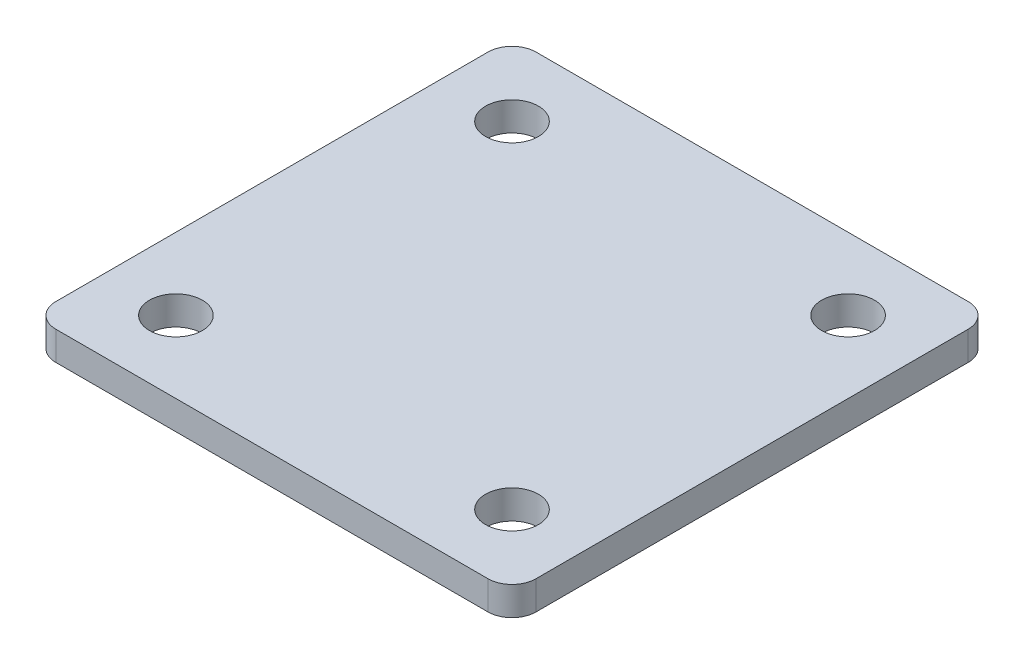
ISO-10303-21;
HEADER;
FILE_DESCRIPTION(('STEP AP214'),'2;1');
FILE_NAME('part.step','',(''),(''),'','','');
FILE_SCHEMA(('AUTOMOTIVE_DESIGN { 1 0 10303 214 1 1 1 1 }'));
ENDSEC;
DATA;
#1=APPLICATION_CONTEXT('core data for automotive mechanical design processes');
#2=APPLICATION_PROTOCOL_DEFINITION('international standard','automotive_design',2000,#1);
#3=PRODUCT_CONTEXT('',#1,'mechanical');
#4=PRODUCT('Part','Part','',(#3));
#5=PRODUCT_RELATED_PRODUCT_CATEGORY('part','',(#4));
#6=PRODUCT_DEFINITION_FORMATION('','',#4);
#7=PRODUCT_DEFINITION_CONTEXT('part definition',#1,'design');
#8=PRODUCT_DEFINITION('design','',#6,#7);
#9=PRODUCT_DEFINITION_SHAPE('','',#8);
#10=(LENGTH_UNIT() NAMED_UNIT(*) SI_UNIT(.MILLI.,.METRE.));
#11=(NAMED_UNIT(*) PLANE_ANGLE_UNIT() SI_UNIT($,.RADIAN.));
#12=(NAMED_UNIT(*) SI_UNIT($,.STERADIAN.) SOLID_ANGLE_UNIT());
#13=UNCERTAINTY_MEASURE_WITH_UNIT(LENGTH_MEASURE(1.E-05),#10,'distance_accuracy_value','');
#14=(GEOMETRIC_REPRESENTATION_CONTEXT(3) GLOBAL_UNCERTAINTY_ASSIGNED_CONTEXT((#13)) GLOBAL_UNIT_ASSIGNED_CONTEXT((#10,
#11,#12)) REPRESENTATION_CONTEXT('',''));
#15=CARTESIAN_POINT('',(0.,0.,0.));
#16=DIRECTION('',(0.,0.,1.));
#17=DIRECTION('',(1.,0.,0.));
#18=AXIS2_PLACEMENT_3D('',#15,#16,#17);
#19=CARTESIAN_POINT('',(50.,6.,-50.));
#20=DIRECTION('',(-1.,0.,0.));
#21=DIRECTION('',(0.,0.,1.));
#22=AXIS2_PLACEMENT_3D('',#19,#20,#21);
#23=PLANE('',#22);
#24=DIRECTION('',(0.,0.,-1.));
#25=VECTOR('',#24,1.);
#26=CARTESIAN_POINT('',(50.,6.,-50.));
#27=LINE('',#26,#25);
#28=CARTESIAN_POINT('',(50.,6.,45.));
#29=VERTEX_POINT('',#28);
#30=CARTESIAN_POINT('',(50.,6.,-45.));
#31=VERTEX_POINT('',#30);
#32=EDGE_CURVE('E137',#29,#31,#27,.T.);
#33=ORIENTED_EDGE('',*,*,#32,.F.);
#34=DIRECTION('',(0.,-1.,0.));
#35=VECTOR('',#34,1.);
#36=CARTESIAN_POINT('',(50.,6.,45.));
#37=LINE('',#36,#35);
#38=CARTESIAN_POINT('',(50.,0.,45.));
#39=VERTEX_POINT('',#38);
#40=EDGE_CURVE('E187',#29,#39,#37,.T.);
#41=ORIENTED_EDGE('',*,*,#40,.T.);
#42=DIRECTION('',(0.,0.,-1.));
#43=VECTOR('',#42,1.);
#44=CARTESIAN_POINT('',(50.,0.,-50.));
#45=LINE('',#44,#43);
#46=CARTESIAN_POINT('',(50.,0.,-45.));
#47=VERTEX_POINT('',#46);
#48=EDGE_CURVE('E202',#39,#47,#45,.T.);
#49=ORIENTED_EDGE('',*,*,#48,.T.);
#50=DIRECTION('',(0.,-1.,0.));
#51=VECTOR('',#50,1.);
#52=CARTESIAN_POINT('',(50.,6.,-45.));
#53=LINE('',#52,#51);
#54=EDGE_CURVE('E184',#47,#31,#53,.F.);
#55=ORIENTED_EDGE('',*,*,#54,.T.);
#56=EDGE_LOOP('',(#33,#41,#49,#55));
#57=FACE_BOUND('',#56,.T.);
#58=ADVANCED_FACE('F41',(#57),#23,.F.);
#59=CARTESIAN_POINT('',(-50.,6.,-50.));
#60=DIRECTION('',(0.,0.,1.));
#61=DIRECTION('',(1.,0.,0.));
#62=AXIS2_PLACEMENT_3D('',#59,#60,#61);
#63=PLANE('',#62);
#64=DIRECTION('',(-1.,0.,0.));
#65=VECTOR('',#64,1.);
#66=CARTESIAN_POINT('',(-50.,6.,-50.));
#67=LINE('',#66,#65);
#68=CARTESIAN_POINT('',(45.,6.,-50.));
#69=VERTEX_POINT('',#68);
#70=CARTESIAN_POINT('',(-45.,6.,-50.));
#71=VERTEX_POINT('',#70);
#72=EDGE_CURVE('E142',#69,#71,#67,.T.);
#73=ORIENTED_EDGE('',*,*,#72,.F.);
#74=DIRECTION('',(0.,-1.,0.));
#75=VECTOR('',#74,1.);
#76=CARTESIAN_POINT('',(45.,6.,-50.));
#77=LINE('',#76,#75);
#78=CARTESIAN_POINT('',(45.,0.,-50.));
#79=VERTEX_POINT('',#78);
#80=EDGE_CURVE('E11',#69,#79,#77,.T.);
#81=ORIENTED_EDGE('',*,*,#80,.T.);
#82=DIRECTION('',(-1.,0.,0.));
#83=VECTOR('',#82,1.);
#84=CARTESIAN_POINT('',(-50.,0.,-50.));
#85=LINE('',#84,#83);
#86=CARTESIAN_POINT('',(-45.,0.,-50.));
#87=VERTEX_POINT('',#86);
#88=EDGE_CURVE('E144',#79,#87,#85,.T.);
#89=ORIENTED_EDGE('',*,*,#88,.T.);
#90=DIRECTION('',(0.,-1.,0.));
#91=VECTOR('',#90,1.);
#92=CARTESIAN_POINT('',(-45.,6.,-50.));
#93=LINE('',#92,#91);
#94=EDGE_CURVE('E50',#87,#71,#93,.F.);
#95=ORIENTED_EDGE('',*,*,#94,.T.);
#96=EDGE_LOOP('',(#73,#81,#89,#95));
#97=FACE_BOUND('',#96,.T.);
#98=ADVANCED_FACE('F208',(#97),#63,.F.);
#99=CARTESIAN_POINT('',(-50.,6.,-50.));
#100=DIRECTION('',(1.,0.,0.));
#101=DIRECTION('',(0.,0.,-1.));
#102=AXIS2_PLACEMENT_3D('',#99,#100,#101);
#103=PLANE('',#102);
#104=DIRECTION('',(0.,0.,1.));
#105=VECTOR('',#104,1.);
#106=CARTESIAN_POINT('',(-50.,0.,-50.));
#107=LINE('',#106,#105);
#108=CARTESIAN_POINT('',(-50.,0.,-45.));
#109=VERTEX_POINT('',#108);
#110=CARTESIAN_POINT('',(-50.,0.,45.));
#111=VERTEX_POINT('',#110);
#112=EDGE_CURVE('E138',#109,#111,#107,.T.);
#113=ORIENTED_EDGE('',*,*,#112,.T.);
#114=DIRECTION('',(0.,-1.,0.));
#115=VECTOR('',#114,1.);
#116=CARTESIAN_POINT('',(-50.,6.,45.));
#117=LINE('',#116,#115);
#118=CARTESIAN_POINT('',(-50.,6.,45.));
#119=VERTEX_POINT('',#118);
#120=EDGE_CURVE('E113',#111,#119,#117,.F.);
#121=ORIENTED_EDGE('',*,*,#120,.T.);
#122=DIRECTION('',(0.,0.,1.));
#123=VECTOR('',#122,1.);
#124=CARTESIAN_POINT('',(-50.,6.,-50.));
#125=LINE('',#124,#123);
#126=CARTESIAN_POINT('',(-50.,6.,-45.));
#127=VERTEX_POINT('',#126);
#128=EDGE_CURVE('E193',#127,#119,#125,.T.);
#129=ORIENTED_EDGE('',*,*,#128,.F.);
#130=DIRECTION('',(0.,-1.,0.));
#131=VECTOR('',#130,1.);
#132=CARTESIAN_POINT('',(-50.,6.,-45.));
#133=LINE('',#132,#131);
#134=EDGE_CURVE('E119',#127,#109,#133,.T.);
#135=ORIENTED_EDGE('',*,*,#134,.T.);
#136=EDGE_LOOP('',(#113,#121,#129,#135));
#137=FACE_BOUND('',#136,.T.);
#138=ADVANCED_FACE('F215',(#137),#103,.F.);
#139=CARTESIAN_POINT('',(-50.,6.,50.));
#140=DIRECTION('',(0.,0.,-1.));
#141=DIRECTION('',(-1.,0.,0.));
#142=AXIS2_PLACEMENT_3D('',#139,#140,#141);
#143=PLANE('',#142);
#144=DIRECTION('',(1.,0.,0.));
#145=VECTOR('',#144,1.);
#146=CARTESIAN_POINT('',(-50.,6.,50.));
#147=LINE('',#146,#145);
#148=CARTESIAN_POINT('',(-45.,6.,50.));
#149=VERTEX_POINT('',#148);
#150=CARTESIAN_POINT('',(45.,6.,50.));
#151=VERTEX_POINT('',#150);
#152=EDGE_CURVE('E129',#149,#151,#147,.T.);
#153=ORIENTED_EDGE('',*,*,#152,.F.);
#154=DIRECTION('',(0.,-1.,0.));
#155=VECTOR('',#154,1.);
#156=CARTESIAN_POINT('',(-45.,6.,50.));
#157=LINE('',#156,#155);
#158=CARTESIAN_POINT('',(-45.,0.,50.));
#159=VERTEX_POINT('',#158);
#160=EDGE_CURVE('E112',#149,#159,#157,.T.);
#161=ORIENTED_EDGE('',*,*,#160,.T.);
#162=DIRECTION('',(1.,0.,0.));
#163=VECTOR('',#162,1.);
#164=CARTESIAN_POINT('',(-50.,0.,50.));
#165=LINE('',#164,#163);
#166=CARTESIAN_POINT('',(45.,0.,50.));
#167=VERTEX_POINT('',#166);
#168=EDGE_CURVE('E126',#159,#167,#165,.T.);
#169=ORIENTED_EDGE('',*,*,#168,.T.);
#170=DIRECTION('',(0.,-1.,0.));
#171=VECTOR('',#170,1.);
#172=CARTESIAN_POINT('',(45.,6.,50.));
#173=LINE('',#172,#171);
#174=EDGE_CURVE('E132',#167,#151,#173,.F.);
#175=ORIENTED_EDGE('',*,*,#174,.T.);
#176=EDGE_LOOP('',(#153,#161,#169,#175));
#177=FACE_BOUND('',#176,.T.);
#178=ADVANCED_FACE('F125',(#177),#143,.F.);
#179=CARTESIAN_POINT('',(0.,6.,0.));
#180=DIRECTION('',(0.,1.,0.));
#181=DIRECTION('',(0.,0.,1.));
#182=AXIS2_PLACEMENT_3D('',#179,#180,#181);
#183=PLANE('',#182);
#184=CARTESIAN_POINT('',(-35.,6.,-35.));
#185=DIRECTION('',(0.,1.,0.));
#186=DIRECTION('',(0.,0.,1.));
#187=AXIS2_PLACEMENT_3D('',#184,#185,#186);
#188=CIRCLE('',#187,5.49999999999999);
#189=CARTESIAN_POINT('',(-35.,6.,-29.5));
#190=VERTEX_POINT('',#189);
#191=EDGE_CURVE('E376',#190,#190,#188,.T.);
#192=ORIENTED_EDGE('',*,*,#191,.F.);
#193=EDGE_LOOP('',(#192));
#194=FACE_BOUND('',#193,.T.);
#195=CARTESIAN_POINT('',(35.,6.,-35.));
#196=DIRECTION('',(0.,1.,0.));
#197=DIRECTION('',(0.,0.,1.));
#198=AXIS2_PLACEMENT_3D('',#195,#196,#197);
#199=CIRCLE('',#198,5.49999999999999);
#200=CARTESIAN_POINT('',(35.,6.,-29.5));
#201=VERTEX_POINT('',#200);
#202=EDGE_CURVE('E158',#201,#201,#199,.T.);
#203=ORIENTED_EDGE('',*,*,#202,.F.);
#204=EDGE_LOOP('',(#203));
#205=FACE_BOUND('',#204,.T.);
#206=CARTESIAN_POINT('',(35.,6.,35.));
#207=DIRECTION('',(0.,1.,0.));
#208=DIRECTION('',(0.,0.,1.));
#209=AXIS2_PLACEMENT_3D('',#206,#207,#208);
#210=CIRCLE('',#209,5.49999999999998);
#211=CARTESIAN_POINT('',(35.,6.,40.5));
#212=VERTEX_POINT('',#211);
#213=EDGE_CURVE('E153',#212,#212,#210,.T.);
#214=ORIENTED_EDGE('',*,*,#213,.F.);
#215=EDGE_LOOP('',(#214));
#216=FACE_BOUND('',#215,.T.);
#217=CARTESIAN_POINT('',(-35.,6.,35.));
#218=DIRECTION('',(0.,1.,0.));
#219=DIRECTION('',(0.,0.,1.));
#220=AXIS2_PLACEMENT_3D('',#217,#218,#219);
#221=CIRCLE('',#220,5.49999999999999);
#222=CARTESIAN_POINT('',(-35.,6.,40.5));
#223=VERTEX_POINT('',#222);
#224=EDGE_CURVE('E152',#223,#223,#221,.T.);
#225=ORIENTED_EDGE('',*,*,#224,.F.);
#226=EDGE_LOOP('',(#225));
#227=FACE_BOUND('',#226,.T.);
#228=ORIENTED_EDGE('',*,*,#128,.T.);
#229=CARTESIAN_POINT('',(-45.,6.,45.));
#230=DIRECTION('',(0.,1.,0.));
#231=DIRECTION('',(0.,0.,1.));
#232=AXIS2_PLACEMENT_3D('',#229,#230,#231);
#233=CIRCLE('',#232,5.);
#234=EDGE_CURVE('E181',#119,#149,#233,.T.);
#235=ORIENTED_EDGE('',*,*,#234,.T.);
#236=ORIENTED_EDGE('',*,*,#152,.T.);
#237=CARTESIAN_POINT('',(45.,6.,45.));
#238=DIRECTION('',(0.,1.,0.));
#239=DIRECTION('',(0.,0.,1.));
#240=AXIS2_PLACEMENT_3D('',#237,#238,#239);
#241=CIRCLE('',#240,5.);
#242=EDGE_CURVE('E178',#151,#29,#241,.T.);
#243=ORIENTED_EDGE('',*,*,#242,.T.);
#244=ORIENTED_EDGE('',*,*,#32,.T.);
#245=CARTESIAN_POINT('',(45.,6.,-45.));
#246=DIRECTION('',(0.,1.,0.));
#247=DIRECTION('',(0.,0.,1.));
#248=AXIS2_PLACEMENT_3D('',#245,#246,#247);
#249=CIRCLE('',#248,5.);
#250=EDGE_CURVE('E63',#31,#69,#249,.T.);
#251=ORIENTED_EDGE('',*,*,#250,.T.);
#252=ORIENTED_EDGE('',*,*,#72,.T.);
#253=CARTESIAN_POINT('',(-45.,6.,-45.));
#254=DIRECTION('',(0.,1.,0.));
#255=DIRECTION('',(0.,0.,1.));
#256=AXIS2_PLACEMENT_3D('',#253,#254,#255);
#257=CIRCLE('',#256,5.);
#258=EDGE_CURVE('E173',#71,#127,#257,.T.);
#259=ORIENTED_EDGE('',*,*,#258,.T.);
#260=EDGE_LOOP('',(#228,#235,#236,#243,#244,#251,#252,#259));
#261=FACE_BOUND('',#260,.T.);
#262=ADVANCED_FACE('F213',(#194,#205,#216,#227,#261),#183,.T.);
#263=CARTESIAN_POINT('',(0.,0.,0.));
#264=DIRECTION('',(0.,1.,0.));
#265=DIRECTION('',(0.,0.,1.));
#266=AXIS2_PLACEMENT_3D('',#263,#264,#265);
#267=PLANE('',#266);
#268=CARTESIAN_POINT('',(-35.,0.,-35.));
#269=DIRECTION('',(0.,1.,0.));
#270=DIRECTION('',(0.,0.,1.));
#271=AXIS2_PLACEMENT_3D('',#268,#269,#270);
#272=CIRCLE('',#271,5.49999999999999);
#273=CARTESIAN_POINT('',(-35.,0.,-29.5));
#274=VERTEX_POINT('',#273);
#275=EDGE_CURVE('E372',#274,#274,#272,.T.);
#276=ORIENTED_EDGE('',*,*,#275,.T.);
#277=EDGE_LOOP('',(#276));
#278=FACE_BOUND('',#277,.T.);
#279=CARTESIAN_POINT('',(35.,0.,-35.));
#280=DIRECTION('',(0.,1.,0.));
#281=DIRECTION('',(0.,0.,1.));
#282=AXIS2_PLACEMENT_3D('',#279,#280,#281);
#283=CIRCLE('',#282,5.49999999999999);
#284=CARTESIAN_POINT('',(35.,0.,-29.5));
#285=VERTEX_POINT('',#284);
#286=EDGE_CURVE('E154',#285,#285,#283,.T.);
#287=ORIENTED_EDGE('',*,*,#286,.T.);
#288=EDGE_LOOP('',(#287));
#289=FACE_BOUND('',#288,.T.);
#290=CARTESIAN_POINT('',(35.,0.,35.));
#291=DIRECTION('',(0.,1.,0.));
#292=DIRECTION('',(0.,0.,1.));
#293=AXIS2_PLACEMENT_3D('',#290,#291,#292);
#294=CIRCLE('',#293,5.49999999999998);
#295=CARTESIAN_POINT('',(35.,0.,40.5));
#296=VERTEX_POINT('',#295);
#297=EDGE_CURVE('E148',#296,#296,#294,.T.);
#298=ORIENTED_EDGE('',*,*,#297,.T.);
#299=EDGE_LOOP('',(#298));
#300=FACE_BOUND('',#299,.T.);
#301=CARTESIAN_POINT('',(-35.,0.,35.));
#302=DIRECTION('',(0.,1.,0.));
#303=DIRECTION('',(0.,0.,1.));
#304=AXIS2_PLACEMENT_3D('',#301,#302,#303);
#305=CIRCLE('',#304,5.49999999999999);
#306=CARTESIAN_POINT('',(-35.,0.,40.5));
#307=VERTEX_POINT('',#306);
#308=EDGE_CURVE('E205',#307,#307,#305,.T.);
#309=ORIENTED_EDGE('',*,*,#308,.T.);
#310=EDGE_LOOP('',(#309));
#311=FACE_BOUND('',#310,.T.);
#312=ORIENTED_EDGE('',*,*,#168,.F.);
#313=CARTESIAN_POINT('',(-45.,0.,45.));
#314=DIRECTION('',(0.,1.,0.));
#315=DIRECTION('',(0.,0.,1.));
#316=AXIS2_PLACEMENT_3D('',#313,#314,#315);
#317=CIRCLE('',#316,5.);
#318=EDGE_CURVE('E108',#159,#111,#317,.F.);
#319=ORIENTED_EDGE('',*,*,#318,.T.);
#320=ORIENTED_EDGE('',*,*,#112,.F.);
#321=CARTESIAN_POINT('',(-45.,0.,-45.));
#322=DIRECTION('',(0.,1.,0.));
#323=DIRECTION('',(0.,0.,1.));
#324=AXIS2_PLACEMENT_3D('',#321,#322,#323);
#325=CIRCLE('',#324,5.);
#326=EDGE_CURVE('E131',#109,#87,#325,.F.);
#327=ORIENTED_EDGE('',*,*,#326,.T.);
#328=ORIENTED_EDGE('',*,*,#88,.F.);
#329=CARTESIAN_POINT('',(45.,0.,-45.));
#330=DIRECTION('',(0.,1.,0.));
#331=DIRECTION('',(0.,0.,1.));
#332=AXIS2_PLACEMENT_3D('',#329,#330,#331);
#333=CIRCLE('',#332,5.);
#334=EDGE_CURVE('E163',#79,#47,#333,.F.);
#335=ORIENTED_EDGE('',*,*,#334,.T.);
#336=ORIENTED_EDGE('',*,*,#48,.F.);
#337=CARTESIAN_POINT('',(45.,0.,45.));
#338=DIRECTION('',(0.,1.,0.));
#339=DIRECTION('',(0.,0.,1.));
#340=AXIS2_PLACEMENT_3D('',#337,#338,#339);
#341=CIRCLE('',#340,5.);
#342=EDGE_CURVE('E120',#39,#167,#341,.F.);
#343=ORIENTED_EDGE('',*,*,#342,.T.);
#344=EDGE_LOOP('',(#312,#319,#320,#327,#328,#335,#336,#343));
#345=FACE_BOUND('',#344,.T.);
#346=ADVANCED_FACE('F134',(#278,#289,#300,#311,#345),#267,.F.);
#347=CARTESIAN_POINT('',(-35.,6.,35.));
#348=DIRECTION('',(0.,1.,0.));
#349=DIRECTION('',(0.,0.,1.));
#350=AXIS2_PLACEMENT_3D('',#347,#348,#349);
#351=CYLINDRICAL_SURFACE('',#350,5.49999999999999);
#352=ORIENTED_EDGE('',*,*,#224,.T.);
#353=EDGE_LOOP('',(#352));
#354=FACE_BOUND('',#353,.T.);
#355=ORIENTED_EDGE('',*,*,#308,.F.);
#356=EDGE_LOOP('',(#355));
#357=FACE_BOUND('',#356,.T.);
#358=ADVANCED_FACE('F276',(#354,#357),#351,.F.);
#359=CARTESIAN_POINT('',(35.,6.,35.));
#360=DIRECTION('',(0.,1.,0.));
#361=DIRECTION('',(0.,0.,1.));
#362=AXIS2_PLACEMENT_3D('',#359,#360,#361);
#363=CYLINDRICAL_SURFACE('',#362,5.49999999999998);
#364=ORIENTED_EDGE('',*,*,#213,.T.);
#365=EDGE_LOOP('',(#364));
#366=FACE_BOUND('',#365,.T.);
#367=ORIENTED_EDGE('',*,*,#297,.F.);
#368=EDGE_LOOP('',(#367));
#369=FACE_BOUND('',#368,.T.);
#370=ADVANCED_FACE('F331',(#366,#369),#363,.F.);
#371=CARTESIAN_POINT('',(35.,6.,-35.));
#372=DIRECTION('',(0.,1.,0.));
#373=DIRECTION('',(0.,0.,1.));
#374=AXIS2_PLACEMENT_3D('',#371,#372,#373);
#375=CYLINDRICAL_SURFACE('',#374,5.49999999999999);
#376=ORIENTED_EDGE('',*,*,#202,.T.);
#377=EDGE_LOOP('',(#376));
#378=FACE_BOUND('',#377,.T.);
#379=ORIENTED_EDGE('',*,*,#286,.F.);
#380=EDGE_LOOP('',(#379));
#381=FACE_BOUND('',#380,.T.);
#382=ADVANCED_FACE('F321',(#378,#381),#375,.F.);
#383=CARTESIAN_POINT('',(-35.,6.,-35.));
#384=DIRECTION('',(0.,1.,0.));
#385=DIRECTION('',(0.,0.,1.));
#386=AXIS2_PLACEMENT_3D('',#383,#384,#385);
#387=CYLINDRICAL_SURFACE('',#386,5.49999999999999);
#388=ORIENTED_EDGE('',*,*,#191,.T.);
#389=EDGE_LOOP('',(#388));
#390=FACE_BOUND('',#389,.T.);
#391=ORIENTED_EDGE('',*,*,#275,.F.);
#392=EDGE_LOOP('',(#391));
#393=FACE_BOUND('',#392,.T.);
#394=ADVANCED_FACE('F234',(#390,#393),#387,.F.);
#395=CARTESIAN_POINT('',(-45.,6.,45.));
#396=DIRECTION('',(0.,-1.,0.));
#397=DIRECTION('',(0.,0.,-1.));
#398=AXIS2_PLACEMENT_3D('',#395,#396,#397);
#399=CYLINDRICAL_SURFACE('',#398,5.);
#400=ORIENTED_EDGE('',*,*,#234,.F.);
#401=ORIENTED_EDGE('',*,*,#120,.F.);
#402=ORIENTED_EDGE('',*,*,#318,.F.);
#403=ORIENTED_EDGE('',*,*,#160,.F.);
#404=EDGE_LOOP('',(#400,#401,#402,#403));
#405=FACE_BOUND('',#404,.T.);
#406=ADVANCED_FACE('F111',(#405),#399,.T.);
#407=CARTESIAN_POINT('',(45.,6.,45.));
#408=DIRECTION('',(0.,-1.,0.));
#409=DIRECTION('',(0.,0.,-1.));
#410=AXIS2_PLACEMENT_3D('',#407,#408,#409);
#411=CYLINDRICAL_SURFACE('',#410,5.);
#412=ORIENTED_EDGE('',*,*,#242,.F.);
#413=ORIENTED_EDGE('',*,*,#174,.F.);
#414=ORIENTED_EDGE('',*,*,#342,.F.);
#415=ORIENTED_EDGE('',*,*,#40,.F.);
#416=EDGE_LOOP('',(#412,#413,#414,#415));
#417=FACE_BOUND('',#416,.T.);
#418=ADVANCED_FACE('F233',(#417),#411,.T.);
#419=CARTESIAN_POINT('',(45.,6.,-45.));
#420=DIRECTION('',(0.,-1.,0.));
#421=DIRECTION('',(0.,0.,-1.));
#422=AXIS2_PLACEMENT_3D('',#419,#420,#421);
#423=CYLINDRICAL_SURFACE('',#422,5.);
#424=ORIENTED_EDGE('',*,*,#250,.F.);
#425=ORIENTED_EDGE('',*,*,#54,.F.);
#426=ORIENTED_EDGE('',*,*,#334,.F.);
#427=ORIENTED_EDGE('',*,*,#80,.F.);
#428=EDGE_LOOP('',(#424,#425,#426,#427));
#429=FACE_BOUND('',#428,.T.);
#430=ADVANCED_FACE('F236',(#429),#423,.T.);
#431=CARTESIAN_POINT('',(-45.,6.,-45.));
#432=DIRECTION('',(0.,-1.,0.));
#433=DIRECTION('',(0.,0.,-1.));
#434=AXIS2_PLACEMENT_3D('',#431,#432,#433);
#435=CYLINDRICAL_SURFACE('',#434,5.);
#436=ORIENTED_EDGE('',*,*,#258,.F.);
#437=ORIENTED_EDGE('',*,*,#94,.F.);
#438=ORIENTED_EDGE('',*,*,#326,.F.);
#439=ORIENTED_EDGE('',*,*,#134,.F.);
#440=EDGE_LOOP('',(#436,#437,#438,#439));
#441=FACE_BOUND('',#440,.T.);
#442=ADVANCED_FACE('F43',(#441),#435,.T.);
#443=CLOSED_SHELL('',(#58,#98,#138,#178,#262,#346,#358,#370,#382,#394,#406,#418,#430,#442));
#444=MANIFOLD_SOLID_BREP('B2',#443);
#445=ADVANCED_BREP_SHAPE_REPRESENTATION('',(#18,#444),#14);
#446=SHAPE_DEFINITION_REPRESENTATION(#9,#445);
ENDSEC;
END-ISO-10303-21;
